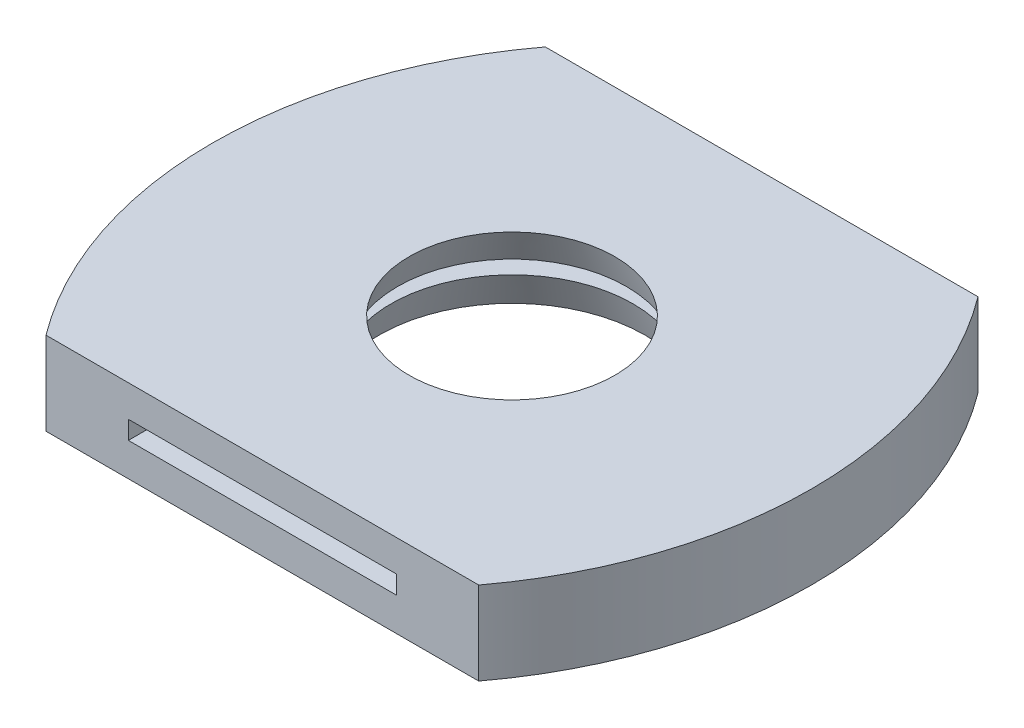
ISO-10303-21;
HEADER;
FILE_DESCRIPTION(('STEP AP214'),'2;1');
FILE_NAME('part.step','',(''),(''),'','','');
FILE_SCHEMA(('AUTOMOTIVE_DESIGN { 1 0 10303 214 1 1 1 1 }'));
ENDSEC;
DATA;
#1=APPLICATION_CONTEXT('core data for automotive mechanical design processes');
#2=APPLICATION_PROTOCOL_DEFINITION('international standard','automotive_design',2000,#1);
#3=PRODUCT_CONTEXT('',#1,'mechanical');
#4=PRODUCT('Part','Part','',(#3));
#5=PRODUCT_RELATED_PRODUCT_CATEGORY('part','',(#4));
#6=PRODUCT_DEFINITION_FORMATION('','',#4);
#7=PRODUCT_DEFINITION_CONTEXT('part definition',#1,'design');
#8=PRODUCT_DEFINITION('design','',#6,#7);
#9=PRODUCT_DEFINITION_SHAPE('','',#8);
#10=(LENGTH_UNIT() NAMED_UNIT(*) SI_UNIT(.MILLI.,.METRE.));
#11=(NAMED_UNIT(*) PLANE_ANGLE_UNIT() SI_UNIT($,.RADIAN.));
#12=(NAMED_UNIT(*) SI_UNIT($,.STERADIAN.) SOLID_ANGLE_UNIT());
#13=UNCERTAINTY_MEASURE_WITH_UNIT(LENGTH_MEASURE(1.E-05),#10,'distance_accuracy_value','');
#14=(GEOMETRIC_REPRESENTATION_CONTEXT(3) GLOBAL_UNCERTAINTY_ASSIGNED_CONTEXT((#13)) GLOBAL_UNIT_ASSIGNED_CONTEXT((#10,
#11,#12)) REPRESENTATION_CONTEXT('',''));
#15=CARTESIAN_POINT('',(0.,0.,0.));
#16=DIRECTION('',(0.,0.,1.));
#17=DIRECTION('',(1.,0.,0.));
#18=AXIS2_PLACEMENT_3D('',#15,#16,#17);
#19=CARTESIAN_POINT('',(0.,50.,0.));
#20=DIRECTION('',(0.,-1.,0.));
#21=DIRECTION('',(0.,0.,-1.));
#22=AXIS2_PLACEMENT_3D('',#19,#20,#21);
#23=CONICAL_SURFACE('',#22,61.8014882866897,0.34906585039887);
#24=CARTESIAN_POINT('',(0.,31.,0.));
#25=DIRECTION('',(0.,1.,0.));
#26=DIRECTION('',(0.,0.,1.));
#27=AXIS2_PLACEMENT_3D('',#24,#25,#26);
#28=CIRCLE('',#27,68.7169227377476);
#29=CARTESIAN_POINT('',(0.,31.,68.7169227377476));
#30=VERTEX_POINT('',#29);
#31=EDGE_CURVE('E48',#30,#30,#28,.T.);
#32=ORIENTED_EDGE('',*,*,#31,.F.);
#33=EDGE_LOOP('',(#32));
#34=FACE_BOUND('',#33,.T.);
#35=CARTESIAN_POINT('',(0.,50.,0.));
#36=DIRECTION('',(0.,-1.,0.));
#37=DIRECTION('',(0.,0.,-1.));
#38=AXIS2_PLACEMENT_3D('',#35,#36,#37);
#39=CIRCLE('',#38,61.8014882866897);
#40=CARTESIAN_POINT('',(0.,50.,-61.8014882866897));
#41=VERTEX_POINT('',#40);
#42=EDGE_CURVE('E163',#41,#41,#39,.T.);
#43=ORIENTED_EDGE('',*,*,#42,.F.);
#44=EDGE_LOOP('',(#43));
#45=FACE_BOUND('',#44,.T.);
#46=ADVANCED_FACE('F44',(#34,#45),#23,.F.);
#47=CARTESIAN_POINT('',(70.,50.,0.));
#48=DIRECTION('',(0.,-1.,0.));
#49=DIRECTION('',(0.,0.,-1.));
#50=AXIS2_PLACEMENT_3D('',#47,#48,#49);
#51=CYLINDRICAL_SURFACE('',#50,250.);
#52=CARTESIAN_POINT('',(70.,0.,0.));
#53=DIRECTION('',(0.,1.,0.));
#54=DIRECTION('',(0.,0.,1.));
#55=AXIS2_PLACEMENT_3D('',#52,#53,#54);
#56=CIRCLE('',#55,250.);
#57=CARTESIAN_POINT('',(-130.,0.,-150.));
#58=VERTEX_POINT('',#57);
#59=CARTESIAN_POINT('',(-130.,0.,150.));
#60=VERTEX_POINT('',#59);
#61=EDGE_CURVE('E169',#58,#60,#56,.T.);
#62=ORIENTED_EDGE('',*,*,#61,.T.);
#63=DIRECTION('',(0.,-1.,0.));
#64=VECTOR('',#63,1.);
#65=CARTESIAN_POINT('',(-130.,50.,150.));
#66=LINE('',#65,#64);
#67=CARTESIAN_POINT('',(-130.,50.,150.));
#68=VERTEX_POINT('',#67);
#69=EDGE_CURVE('E11',#68,#60,#66,.T.);
#70=ORIENTED_EDGE('',*,*,#69,.F.);
#71=CARTESIAN_POINT('',(70.,50.,0.));
#72=DIRECTION('',(0.,1.,0.));
#73=DIRECTION('',(0.,0.,1.));
#74=AXIS2_PLACEMENT_3D('',#71,#72,#73);
#75=CIRCLE('',#74,250.);
#76=CARTESIAN_POINT('',(-130.,50.,-150.));
#77=VERTEX_POINT('',#76);
#78=EDGE_CURVE('E170',#77,#68,#75,.T.);
#79=ORIENTED_EDGE('',*,*,#78,.F.);
#80=DIRECTION('',(0.,-1.,0.));
#81=VECTOR('',#80,1.);
#82=CARTESIAN_POINT('',(-130.,50.,-150.));
#83=LINE('',#82,#81);
#84=EDGE_CURVE('E176',#77,#58,#83,.T.);
#85=ORIENTED_EDGE('',*,*,#84,.T.);
#86=EDGE_LOOP('',(#62,#70,#79,#85));
#87=FACE_BOUND('',#86,.T.);
#88=ADVANCED_FACE('F46',(#87),#51,.T.);
#89=CARTESIAN_POINT('',(-130.,50.,150.));
#90=DIRECTION('',(0.,0.,-1.));
#91=DIRECTION('',(-1.,0.,0.));
#92=AXIS2_PLACEMENT_3D('',#89,#90,#91);
#93=PLANE('',#92);
#94=DIRECTION('',(1.,0.,0.));
#95=VECTOR('',#94,1.);
#96=CARTESIAN_POINT('',(-80.5,20.,150.));
#97=LINE('',#96,#95);
#98=CARTESIAN_POINT('',(-80.5,20.,150.));
#99=VERTEX_POINT('',#98);
#100=CARTESIAN_POINT('',(80.5,20.,150.));
#101=VERTEX_POINT('',#100);
#102=EDGE_CURVE('E152',#99,#101,#97,.T.);
#103=ORIENTED_EDGE('',*,*,#102,.F.);
#104=DIRECTION('',(0.,-1.,0.));
#105=VECTOR('',#104,1.);
#106=CARTESIAN_POINT('',(-80.5,31.,150.));
#107=LINE('',#106,#105);
#108=CARTESIAN_POINT('',(-80.5,31.,150.));
#109=VERTEX_POINT('',#108);
#110=EDGE_CURVE('E61',#109,#99,#107,.T.);
#111=ORIENTED_EDGE('',*,*,#110,.F.);
#112=DIRECTION('',(-1.,0.,0.));
#113=VECTOR('',#112,1.);
#114=CARTESIAN_POINT('',(-80.5,31.,150.));
#115=LINE('',#114,#113);
#116=CARTESIAN_POINT('',(80.5,31.,150.));
#117=VERTEX_POINT('',#116);
#118=EDGE_CURVE('E140',#117,#109,#115,.T.);
#119=ORIENTED_EDGE('',*,*,#118,.F.);
#120=DIRECTION('',(0.,1.,0.));
#121=VECTOR('',#120,1.);
#122=CARTESIAN_POINT('',(80.5,31.,150.));
#123=LINE('',#122,#121);
#124=EDGE_CURVE('E143',#101,#117,#123,.T.);
#125=ORIENTED_EDGE('',*,*,#124,.F.);
#126=EDGE_LOOP('',(#103,#111,#119,#125));
#127=FACE_BOUND('',#126,.T.);
#128=DIRECTION('',(1.,0.,0.));
#129=VECTOR('',#128,1.);
#130=CARTESIAN_POINT('',(-130.,0.,150.));
#131=LINE('',#130,#129);
#132=CARTESIAN_POINT('',(130.,0.,150.));
#133=VERTEX_POINT('',#132);
#134=EDGE_CURVE('E179',#60,#133,#131,.T.);
#135=ORIENTED_EDGE('',*,*,#134,.T.);
#136=DIRECTION('',(0.,-1.,0.));
#137=VECTOR('',#136,1.);
#138=CARTESIAN_POINT('',(130.,50.,150.));
#139=LINE('',#138,#137);
#140=CARTESIAN_POINT('',(130.,50.,150.));
#141=VERTEX_POINT('',#140);
#142=EDGE_CURVE('E53',#141,#133,#139,.T.);
#143=ORIENTED_EDGE('',*,*,#142,.F.);
#144=DIRECTION('',(1.,0.,0.));
#145=VECTOR('',#144,1.);
#146=CARTESIAN_POINT('',(-130.,50.,150.));
#147=LINE('',#146,#145);
#148=EDGE_CURVE('E98',#68,#141,#147,.T.);
#149=ORIENTED_EDGE('',*,*,#148,.F.);
#150=ORIENTED_EDGE('',*,*,#69,.T.);
#151=EDGE_LOOP('',(#135,#143,#149,#150));
#152=FACE_BOUND('',#151,.T.);
#153=ADVANCED_FACE('F212',(#127,#152),#93,.F.);
#154=CARTESIAN_POINT('',(-70.,50.,0.));
#155=DIRECTION('',(0.,-1.,0.));
#156=DIRECTION('',(0.,0.,-1.));
#157=AXIS2_PLACEMENT_3D('',#154,#155,#156);
#158=CYLINDRICAL_SURFACE('',#157,250.);
#159=CARTESIAN_POINT('',(-70.,0.,0.));
#160=DIRECTION('',(0.,1.,0.));
#161=DIRECTION('',(0.,0.,-1.));
#162=AXIS2_PLACEMENT_3D('',#159,#160,#161);
#163=CIRCLE('',#162,250.);
#164=CARTESIAN_POINT('',(130.,0.,-150.));
#165=VERTEX_POINT('',#164);
#166=EDGE_CURVE('E181',#133,#165,#163,.T.);
#167=ORIENTED_EDGE('',*,*,#166,.T.);
#168=DIRECTION('',(0.,-1.,0.));
#169=VECTOR('',#168,1.);
#170=CARTESIAN_POINT('',(130.,50.,-150.));
#171=LINE('',#170,#169);
#172=CARTESIAN_POINT('',(130.,50.,-150.));
#173=VERTEX_POINT('',#172);
#174=EDGE_CURVE('E185',#173,#165,#171,.T.);
#175=ORIENTED_EDGE('',*,*,#174,.F.);
#176=CARTESIAN_POINT('',(-70.,50.,0.));
#177=DIRECTION('',(0.,1.,0.));
#178=DIRECTION('',(0.,0.,-1.));
#179=AXIS2_PLACEMENT_3D('',#176,#177,#178);
#180=CIRCLE('',#179,250.);
#181=EDGE_CURVE('E173',#141,#173,#180,.T.);
#182=ORIENTED_EDGE('',*,*,#181,.F.);
#183=ORIENTED_EDGE('',*,*,#142,.T.);
#184=EDGE_LOOP('',(#167,#175,#182,#183));
#185=FACE_BOUND('',#184,.T.);
#186=ADVANCED_FACE('F217',(#185),#158,.T.);
#187=CARTESIAN_POINT('',(-130.,50.,-150.));
#188=DIRECTION('',(0.,0.,1.));
#189=DIRECTION('',(1.,0.,0.));
#190=AXIS2_PLACEMENT_3D('',#187,#188,#189);
#191=PLANE('',#190);
#192=DIRECTION('',(-1.,0.,0.));
#193=VECTOR('',#192,1.);
#194=CARTESIAN_POINT('',(-130.,0.,-150.));
#195=LINE('',#194,#193);
#196=EDGE_CURVE('E91',#165,#58,#195,.T.);
#197=ORIENTED_EDGE('',*,*,#196,.T.);
#198=ORIENTED_EDGE('',*,*,#84,.F.);
#199=DIRECTION('',(-1.,0.,0.));
#200=VECTOR('',#199,1.);
#201=CARTESIAN_POINT('',(-130.,50.,-150.));
#202=LINE('',#201,#200);
#203=EDGE_CURVE('E70',#173,#77,#202,.T.);
#204=ORIENTED_EDGE('',*,*,#203,.F.);
#205=ORIENTED_EDGE('',*,*,#174,.T.);
#206=EDGE_LOOP('',(#197,#198,#204,#205));
#207=FACE_BOUND('',#206,.T.);
#208=ADVANCED_FACE('F206',(#207),#191,.F.);
#209=CARTESIAN_POINT('',(70.,50.,0.));
#210=DIRECTION('',(0.,1.,0.));
#211=DIRECTION('',(0.,0.,1.));
#212=AXIS2_PLACEMENT_3D('',#209,#210,#211);
#213=PLANE('',#212);
#214=ORIENTED_EDGE('',*,*,#42,.T.);
#215=EDGE_LOOP('',(#214));
#216=FACE_BOUND('',#215,.T.);
#217=ORIENTED_EDGE('',*,*,#78,.T.);
#218=ORIENTED_EDGE('',*,*,#148,.T.);
#219=ORIENTED_EDGE('',*,*,#181,.T.);
#220=ORIENTED_EDGE('',*,*,#203,.T.);
#221=EDGE_LOOP('',(#217,#218,#219,#220));
#222=FACE_BOUND('',#221,.T.);
#223=ADVANCED_FACE('F203',(#216,#222),#213,.T.);
#224=CARTESIAN_POINT('',(70.,0.,0.));
#225=DIRECTION('',(0.,1.,0.));
#226=DIRECTION('',(0.,0.,1.));
#227=AXIS2_PLACEMENT_3D('',#224,#225,#226);
#228=PLANE('',#227);
#229=CARTESIAN_POINT('',(-110.,0.,-139.));
#230=DIRECTION('',(0.,-1.,0.));
#231=DIRECTION('',(0.,0.,-1.));
#232=AXIS2_PLACEMENT_3D('',#229,#230,#231);
#233=CIRCLE('',#232,3.00000000000001);
#234=CARTESIAN_POINT('',(-110.,0.,-142.));
#235=VERTEX_POINT('',#234);
#236=EDGE_CURVE('E313',#235,#235,#233,.T.);
#237=ORIENTED_EDGE('',*,*,#236,.F.);
#238=EDGE_LOOP('',(#237));
#239=FACE_BOUND('',#238,.T.);
#240=CARTESIAN_POINT('',(-82.,0.,-139.));
#241=DIRECTION('',(0.,-1.,0.));
#242=DIRECTION('',(0.,0.,-1.));
#243=AXIS2_PLACEMENT_3D('',#240,#241,#242);
#244=CIRCLE('',#243,3.00000000000001);
#245=CARTESIAN_POINT('',(-82.,0.,-142.));
#246=VERTEX_POINT('',#245);
#247=EDGE_CURVE('E316',#246,#246,#244,.T.);
#248=ORIENTED_EDGE('',*,*,#247,.F.);
#249=EDGE_LOOP('',(#248));
#250=FACE_BOUND('',#249,.T.);
#251=CARTESIAN_POINT('',(-54.,0.,-139.));
#252=DIRECTION('',(0.,-1.,0.));
#253=DIRECTION('',(0.,0.,-1.));
#254=AXIS2_PLACEMENT_3D('',#251,#252,#253);
#255=CIRCLE('',#254,3.);
#256=CARTESIAN_POINT('',(-54.,0.,-142.));
#257=VERTEX_POINT('',#256);
#258=EDGE_CURVE('E324',#257,#257,#255,.T.);
#259=ORIENTED_EDGE('',*,*,#258,.F.);
#260=EDGE_LOOP('',(#259));
#261=FACE_BOUND('',#260,.T.);
#262=CARTESIAN_POINT('',(54.,0.,-139.));
#263=DIRECTION('',(0.,-1.,0.));
#264=DIRECTION('',(0.,0.,-1.));
#265=AXIS2_PLACEMENT_3D('',#262,#263,#264);
#266=CIRCLE('',#265,3.);
#267=CARTESIAN_POINT('',(54.,0.,-142.));
#268=VERTEX_POINT('',#267);
#269=EDGE_CURVE('E330',#268,#268,#266,.T.);
#270=ORIENTED_EDGE('',*,*,#269,.F.);
#271=EDGE_LOOP('',(#270));
#272=FACE_BOUND('',#271,.T.);
#273=CARTESIAN_POINT('',(82.,0.,-139.));
#274=DIRECTION('',(0.,-1.,0.));
#275=DIRECTION('',(0.,0.,-1.));
#276=AXIS2_PLACEMENT_3D('',#273,#274,#275);
#277=CIRCLE('',#276,3.00000000000001);
#278=CARTESIAN_POINT('',(82.,0.,-142.));
#279=VERTEX_POINT('',#278);
#280=EDGE_CURVE('E336',#279,#279,#277,.T.);
#281=ORIENTED_EDGE('',*,*,#280,.F.);
#282=EDGE_LOOP('',(#281));
#283=FACE_BOUND('',#282,.T.);
#284=CARTESIAN_POINT('',(110.,0.,-139.));
#285=DIRECTION('',(0.,-1.,0.));
#286=DIRECTION('',(0.,0.,-1.));
#287=AXIS2_PLACEMENT_3D('',#284,#285,#286);
#288=CIRCLE('',#287,3.00000000000001);
#289=CARTESIAN_POINT('',(110.,0.,-142.));
#290=VERTEX_POINT('',#289);
#291=EDGE_CURVE('E341',#290,#290,#288,.T.);
#292=ORIENTED_EDGE('',*,*,#291,.F.);
#293=EDGE_LOOP('',(#292));
#294=FACE_BOUND('',#293,.T.);
#295=CARTESIAN_POINT('',(0.,0.,0.));
#296=DIRECTION('',(0.,-1.,0.));
#297=DIRECTION('',(0.,0.,-1.));
#298=AXIS2_PLACEMENT_3D('',#295,#296,#297);
#299=CIRCLE('',#298,80.);
#300=CARTESIAN_POINT('',(0.,0.,-80.));
#301=VERTEX_POINT('',#300);
#302=EDGE_CURVE('E166',#301,#301,#299,.T.);
#303=ORIENTED_EDGE('',*,*,#302,.F.);
#304=EDGE_LOOP('',(#303));
#305=FACE_BOUND('',#304,.T.);
#306=ORIENTED_EDGE('',*,*,#61,.F.);
#307=ORIENTED_EDGE('',*,*,#196,.F.);
#308=ORIENTED_EDGE('',*,*,#166,.F.);
#309=ORIENTED_EDGE('',*,*,#134,.F.);
#310=EDGE_LOOP('',(#306,#307,#308,#309));
#311=FACE_BOUND('',#310,.T.);
#312=ADVANCED_FACE('F205',(#239,#250,#261,#272,#283,#294,#305,#311),#228,.F.);
#313=CARTESIAN_POINT('',(0.,20.,0.));
#314=DIRECTION('',(0.,-1.,0.));
#315=DIRECTION('',(0.,0.,-1.));
#316=AXIS2_PLACEMENT_3D('',#313,#314,#315);
#317=CIRCLE('',#316,72.7205953146758);
#318=CARTESIAN_POINT('',(0.,20.,-72.7205953146758));
#319=VERTEX_POINT('',#318);
#320=EDGE_CURVE('E159',#319,#319,#317,.T.);
#321=ORIENTED_EDGE('',*,*,#320,.F.);
#322=EDGE_LOOP('',(#321));
#323=FACE_BOUND('',#322,.T.);
#324=ORIENTED_EDGE('',*,*,#302,.T.);
#325=EDGE_LOOP('',(#324));
#326=FACE_BOUND('',#325,.T.);
#327=ADVANCED_FACE('F200',(#323,#326),#23,.F.);
#328=CARTESIAN_POINT('',(-80.5,31.,-130.));
#329=DIRECTION('',(-1.,0.,0.));
#330=DIRECTION('',(0.,0.,1.));
#331=AXIS2_PLACEMENT_3D('',#328,#329,#330);
#332=PLANE('',#331);
#333=ORIENTED_EDGE('',*,*,#110,.T.);
#334=DIRECTION('',(0.,0.,1.));
#335=VECTOR('',#334,1.);
#336=CARTESIAN_POINT('',(-80.5,20.,-130.));
#337=LINE('',#336,#335);
#338=CARTESIAN_POINT('',(-80.5,20.,-130.));
#339=VERTEX_POINT('',#338);
#340=EDGE_CURVE('E118',#339,#99,#337,.T.);
#341=ORIENTED_EDGE('',*,*,#340,.F.);
#342=DIRECTION('',(0.,-1.,0.));
#343=VECTOR('',#342,1.);
#344=CARTESIAN_POINT('',(-80.5,31.,-130.));
#345=LINE('',#344,#343);
#346=CARTESIAN_POINT('',(-80.5,31.,-130.));
#347=VERTEX_POINT('',#346);
#348=EDGE_CURVE('E122',#347,#339,#345,.T.);
#349=ORIENTED_EDGE('',*,*,#348,.F.);
#350=DIRECTION('',(0.,0.,1.));
#351=VECTOR('',#350,1.);
#352=CARTESIAN_POINT('',(-80.5,31.,-130.));
#353=LINE('',#352,#351);
#354=EDGE_CURVE('E157',#347,#109,#353,.T.);
#355=ORIENTED_EDGE('',*,*,#354,.T.);
#356=EDGE_LOOP('',(#333,#341,#349,#355));
#357=FACE_BOUND('',#356,.T.);
#358=ADVANCED_FACE('F120',(#357),#332,.F.);
#359=CARTESIAN_POINT('',(-80.5,31.,-130.));
#360=DIRECTION('',(0.,1.,0.));
#361=DIRECTION('',(0.,0.,1.));
#362=AXIS2_PLACEMENT_3D('',#359,#360,#361);
#363=PLANE('',#362);
#364=ORIENTED_EDGE('',*,*,#31,.T.);
#365=EDGE_LOOP('',(#364));
#366=FACE_BOUND('',#365,.T.);
#367=ORIENTED_EDGE('',*,*,#118,.T.);
#368=ORIENTED_EDGE('',*,*,#354,.F.);
#369=DIRECTION('',(-1.,0.,0.));
#370=VECTOR('',#369,1.);
#371=CARTESIAN_POINT('',(-80.5,31.,-130.));
#372=LINE('',#371,#370);
#373=CARTESIAN_POINT('',(80.5,31.,-130.));
#374=VERTEX_POINT('',#373);
#375=EDGE_CURVE('E128',#374,#347,#372,.T.);
#376=ORIENTED_EDGE('',*,*,#375,.F.);
#377=DIRECTION('',(0.,0.,1.));
#378=VECTOR('',#377,1.);
#379=CARTESIAN_POINT('',(80.5,31.,-130.));
#380=LINE('',#379,#378);
#381=EDGE_CURVE('E160',#374,#117,#380,.T.);
#382=ORIENTED_EDGE('',*,*,#381,.T.);
#383=EDGE_LOOP('',(#367,#368,#376,#382));
#384=FACE_BOUND('',#383,.T.);
#385=ADVANCED_FACE('F194',(#366,#384),#363,.F.);
#386=CARTESIAN_POINT('',(80.5,31.,-130.));
#387=DIRECTION('',(1.,0.,0.));
#388=DIRECTION('',(0.,0.,-1.));
#389=AXIS2_PLACEMENT_3D('',#386,#387,#388);
#390=PLANE('',#389);
#391=ORIENTED_EDGE('',*,*,#124,.T.);
#392=ORIENTED_EDGE('',*,*,#381,.F.);
#393=DIRECTION('',(0.,1.,0.));
#394=VECTOR('',#393,1.);
#395=CARTESIAN_POINT('',(80.5,31.,-130.));
#396=LINE('',#395,#394);
#397=CARTESIAN_POINT('',(80.5,20.,-130.));
#398=VERTEX_POINT('',#397);
#399=EDGE_CURVE('E136',#398,#374,#396,.T.);
#400=ORIENTED_EDGE('',*,*,#399,.F.);
#401=DIRECTION('',(0.,0.,1.));
#402=VECTOR('',#401,1.);
#403=CARTESIAN_POINT('',(80.5,20.,-130.));
#404=LINE('',#403,#402);
#405=EDGE_CURVE('E127',#398,#101,#404,.T.);
#406=ORIENTED_EDGE('',*,*,#405,.T.);
#407=EDGE_LOOP('',(#391,#392,#400,#406));
#408=FACE_BOUND('',#407,.T.);
#409=ADVANCED_FACE('F240',(#408),#390,.F.);
#410=CARTESIAN_POINT('',(-80.5,20.,-130.));
#411=DIRECTION('',(0.,-1.,0.));
#412=DIRECTION('',(0.,0.,-1.));
#413=AXIS2_PLACEMENT_3D('',#410,#411,#412);
#414=PLANE('',#413);
#415=ORIENTED_EDGE('',*,*,#320,.T.);
#416=EDGE_LOOP('',(#415));
#417=FACE_BOUND('',#416,.T.);
#418=ORIENTED_EDGE('',*,*,#102,.T.);
#419=ORIENTED_EDGE('',*,*,#405,.F.);
#420=DIRECTION('',(1.,0.,0.));
#421=VECTOR('',#420,1.);
#422=CARTESIAN_POINT('',(-80.5,20.,-130.));
#423=LINE('',#422,#421);
#424=EDGE_CURVE('E131',#339,#398,#423,.T.);
#425=ORIENTED_EDGE('',*,*,#424,.F.);
#426=ORIENTED_EDGE('',*,*,#340,.T.);
#427=EDGE_LOOP('',(#418,#419,#425,#426));
#428=FACE_BOUND('',#427,.T.);
#429=ADVANCED_FACE('F132',(#417,#428),#414,.F.);
#430=CARTESIAN_POINT('',(0.,0.,-130.));
#431=DIRECTION('',(0.,0.,1.));
#432=DIRECTION('',(1.,0.,0.));
#433=AXIS2_PLACEMENT_3D('',#430,#431,#432);
#434=PLANE('',#433);
#435=ORIENTED_EDGE('',*,*,#348,.T.);
#436=ORIENTED_EDGE('',*,*,#424,.T.);
#437=ORIENTED_EDGE('',*,*,#399,.T.);
#438=ORIENTED_EDGE('',*,*,#375,.T.);
#439=EDGE_LOOP('',(#435,#436,#437,#438));
#440=FACE_BOUND('',#439,.T.);
#441=ADVANCED_FACE('F138',(#440),#434,.T.);
#442=CARTESIAN_POINT('',(110.,20.,-139.));
#443=DIRECTION('',(0.,-1.,0.));
#444=DIRECTION('',(0.,0.,-1.));
#445=AXIS2_PLACEMENT_3D('',#442,#443,#444);
#446=CYLINDRICAL_SURFACE('',#445,3.00000000000001);
#447=CARTESIAN_POINT('',(110.,20.,-139.));
#448=DIRECTION('',(0.,-1.,0.));
#449=DIRECTION('',(0.,0.,-1.));
#450=AXIS2_PLACEMENT_3D('',#447,#448,#449);
#451=CIRCLE('',#450,3.00000000000001);
#452=CARTESIAN_POINT('',(110.,20.,-142.));
#453=VERTEX_POINT('',#452);
#454=EDGE_CURVE('E146',#453,#453,#451,.T.);
#455=ORIENTED_EDGE('',*,*,#454,.F.);
#456=EDGE_LOOP('',(#455));
#457=FACE_BOUND('',#456,.T.);
#458=ORIENTED_EDGE('',*,*,#291,.T.);
#459=EDGE_LOOP('',(#458));
#460=FACE_BOUND('',#459,.T.);
#461=ADVANCED_FACE('F256',(#457,#460),#446,.F.);
#462=CARTESIAN_POINT('',(110.,20.,-139.));
#463=DIRECTION('',(0.,-1.,0.));
#464=DIRECTION('',(0.,0.,-1.));
#465=AXIS2_PLACEMENT_3D('',#462,#463,#464);
#466=PLANE('',#465);
#467=ORIENTED_EDGE('',*,*,#454,.T.);
#468=EDGE_LOOP('',(#467));
#469=FACE_BOUND('',#468,.T.);
#470=ADVANCED_FACE('F260',(#469),#466,.T.);
#471=CARTESIAN_POINT('',(82.,20.,-139.));
#472=DIRECTION('',(0.,-1.,0.));
#473=DIRECTION('',(0.,0.,-1.));
#474=AXIS2_PLACEMENT_3D('',#471,#472,#473);
#475=CYLINDRICAL_SURFACE('',#474,3.00000000000001);
#476=CARTESIAN_POINT('',(82.,20.,-139.));
#477=DIRECTION('',(0.,-1.,0.));
#478=DIRECTION('',(0.,0.,-1.));
#479=AXIS2_PLACEMENT_3D('',#476,#477,#478);
#480=CIRCLE('',#479,3.00000000000001);
#481=CARTESIAN_POINT('',(82.,20.,-142.));
#482=VERTEX_POINT('',#481);
#483=EDGE_CURVE('E339',#482,#482,#480,.T.);
#484=ORIENTED_EDGE('',*,*,#483,.F.);
#485=EDGE_LOOP('',(#484));
#486=FACE_BOUND('',#485,.T.);
#487=ORIENTED_EDGE('',*,*,#280,.T.);
#488=EDGE_LOOP('',(#487));
#489=FACE_BOUND('',#488,.T.);
#490=ADVANCED_FACE('F266',(#486,#489),#475,.F.);
#491=CARTESIAN_POINT('',(82.,20.,-139.));
#492=DIRECTION('',(0.,-1.,0.));
#493=DIRECTION('',(0.,0.,-1.));
#494=AXIS2_PLACEMENT_3D('',#491,#492,#493);
#495=PLANE('',#494);
#496=ORIENTED_EDGE('',*,*,#483,.T.);
#497=EDGE_LOOP('',(#496));
#498=FACE_BOUND('',#497,.T.);
#499=ADVANCED_FACE('F271',(#498),#495,.T.);
#500=CARTESIAN_POINT('',(54.,20.,-139.));
#501=DIRECTION('',(0.,-1.,0.));
#502=DIRECTION('',(0.,0.,-1.));
#503=AXIS2_PLACEMENT_3D('',#500,#501,#502);
#504=CYLINDRICAL_SURFACE('',#503,3.);
#505=CARTESIAN_POINT('',(54.,20.,-139.));
#506=DIRECTION('',(0.,-1.,0.));
#507=DIRECTION('',(0.,0.,-1.));
#508=AXIS2_PLACEMENT_3D('',#505,#506,#507);
#509=CIRCLE('',#508,3.);
#510=CARTESIAN_POINT('',(54.,20.,-142.));
#511=VERTEX_POINT('',#510);
#512=EDGE_CURVE('E333',#511,#511,#509,.T.);
#513=ORIENTED_EDGE('',*,*,#512,.F.);
#514=EDGE_LOOP('',(#513));
#515=FACE_BOUND('',#514,.T.);
#516=ORIENTED_EDGE('',*,*,#269,.T.);
#517=EDGE_LOOP('',(#516));
#518=FACE_BOUND('',#517,.T.);
#519=ADVANCED_FACE('F274',(#515,#518),#504,.F.);
#520=CARTESIAN_POINT('',(54.,20.,-139.));
#521=DIRECTION('',(0.,-1.,0.));
#522=DIRECTION('',(0.,0.,-1.));
#523=AXIS2_PLACEMENT_3D('',#520,#521,#522);
#524=PLANE('',#523);
#525=ORIENTED_EDGE('',*,*,#512,.T.);
#526=EDGE_LOOP('',(#525));
#527=FACE_BOUND('',#526,.T.);
#528=ADVANCED_FACE('F279',(#527),#524,.T.);
#529=CARTESIAN_POINT('',(-54.,20.,-139.));
#530=DIRECTION('',(0.,-1.,0.));
#531=DIRECTION('',(0.,0.,-1.));
#532=AXIS2_PLACEMENT_3D('',#529,#530,#531);
#533=CYLINDRICAL_SURFACE('',#532,3.);
#534=CARTESIAN_POINT('',(-54.,20.,-139.));
#535=DIRECTION('',(0.,-1.,0.));
#536=DIRECTION('',(0.,0.,-1.));
#537=AXIS2_PLACEMENT_3D('',#534,#535,#536);
#538=CIRCLE('',#537,3.);
#539=CARTESIAN_POINT('',(-54.,20.,-142.));
#540=VERTEX_POINT('',#539);
#541=EDGE_CURVE('E327',#540,#540,#538,.T.);
#542=ORIENTED_EDGE('',*,*,#541,.F.);
#543=EDGE_LOOP('',(#542));
#544=FACE_BOUND('',#543,.T.);
#545=ORIENTED_EDGE('',*,*,#258,.T.);
#546=EDGE_LOOP('',(#545));
#547=FACE_BOUND('',#546,.T.);
#548=ADVANCED_FACE('F282',(#544,#547),#533,.F.);
#549=CARTESIAN_POINT('',(-54.,20.,-139.));
#550=DIRECTION('',(0.,-1.,0.));
#551=DIRECTION('',(0.,0.,-1.));
#552=AXIS2_PLACEMENT_3D('',#549,#550,#551);
#553=PLANE('',#552);
#554=ORIENTED_EDGE('',*,*,#541,.T.);
#555=EDGE_LOOP('',(#554));
#556=FACE_BOUND('',#555,.T.);
#557=ADVANCED_FACE('F287',(#556),#553,.T.);
#558=CARTESIAN_POINT('',(-82.,20.,-139.));
#559=DIRECTION('',(0.,-1.,0.));
#560=DIRECTION('',(0.,0.,-1.));
#561=AXIS2_PLACEMENT_3D('',#558,#559,#560);
#562=CYLINDRICAL_SURFACE('',#561,3.00000000000001);
#563=CARTESIAN_POINT('',(-82.,20.,-139.));
#564=DIRECTION('',(0.,-1.,0.));
#565=DIRECTION('',(0.,0.,-1.));
#566=AXIS2_PLACEMENT_3D('',#563,#564,#565);
#567=CIRCLE('',#566,3.00000000000001);
#568=CARTESIAN_POINT('',(-82.,20.,-142.));
#569=VERTEX_POINT('',#568);
#570=EDGE_CURVE('E321',#569,#569,#567,.T.);
#571=ORIENTED_EDGE('',*,*,#570,.F.);
#572=EDGE_LOOP('',(#571));
#573=FACE_BOUND('',#572,.T.);
#574=ORIENTED_EDGE('',*,*,#247,.T.);
#575=EDGE_LOOP('',(#574));
#576=FACE_BOUND('',#575,.T.);
#577=ADVANCED_FACE('F290',(#573,#576),#562,.F.);
#578=CARTESIAN_POINT('',(-82.,20.,-139.));
#579=DIRECTION('',(0.,-1.,0.));
#580=DIRECTION('',(0.,0.,-1.));
#581=AXIS2_PLACEMENT_3D('',#578,#579,#580);
#582=PLANE('',#581);
#583=ORIENTED_EDGE('',*,*,#570,.T.);
#584=EDGE_LOOP('',(#583));
#585=FACE_BOUND('',#584,.T.);
#586=ADVANCED_FACE('F295',(#585),#582,.T.);
#587=CARTESIAN_POINT('',(-110.,20.,-139.));
#588=DIRECTION('',(0.,-1.,0.));
#589=DIRECTION('',(0.,0.,-1.));
#590=AXIS2_PLACEMENT_3D('',#587,#588,#589);
#591=CYLINDRICAL_SURFACE('',#590,3.00000000000001);
#592=CARTESIAN_POINT('',(-110.,20.,-139.));
#593=DIRECTION('',(0.,-1.,0.));
#594=DIRECTION('',(0.,0.,-1.));
#595=AXIS2_PLACEMENT_3D('',#592,#593,#594);
#596=CIRCLE('',#595,3.00000000000001);
#597=CARTESIAN_POINT('',(-110.,20.,-142.));
#598=VERTEX_POINT('',#597);
#599=EDGE_CURVE('E153',#598,#598,#596,.T.);
#600=ORIENTED_EDGE('',*,*,#599,.F.);
#601=EDGE_LOOP('',(#600));
#602=FACE_BOUND('',#601,.T.);
#603=ORIENTED_EDGE('',*,*,#236,.T.);
#604=EDGE_LOOP('',(#603));
#605=FACE_BOUND('',#604,.T.);
#606=ADVANCED_FACE('F298',(#602,#605),#591,.F.);
#607=CARTESIAN_POINT('',(-110.,20.,-139.));
#608=DIRECTION('',(0.,-1.,0.));
#609=DIRECTION('',(0.,0.,-1.));
#610=AXIS2_PLACEMENT_3D('',#607,#608,#609);
#611=PLANE('',#610);
#612=ORIENTED_EDGE('',*,*,#599,.T.);
#613=EDGE_LOOP('',(#612));
#614=FACE_BOUND('',#613,.T.);
#615=ADVANCED_FACE('F305',(#614),#611,.T.);
#616=CLOSED_SHELL('',(#46,#88,#153,#186,#208,#223,#312,#327,#358,#385,#409,#429,#441,#461,#470,
#490,#499,#519,#528,#548,#557,#577,#586,#606,#615));
#617=MANIFOLD_SOLID_BREP('B2',#616);
#618=ADVANCED_BREP_SHAPE_REPRESENTATION('',(#18,#617),#14);
#619=SHAPE_DEFINITION_REPRESENTATION(#9,#618);
ENDSEC;
END-ISO-10303-21;
